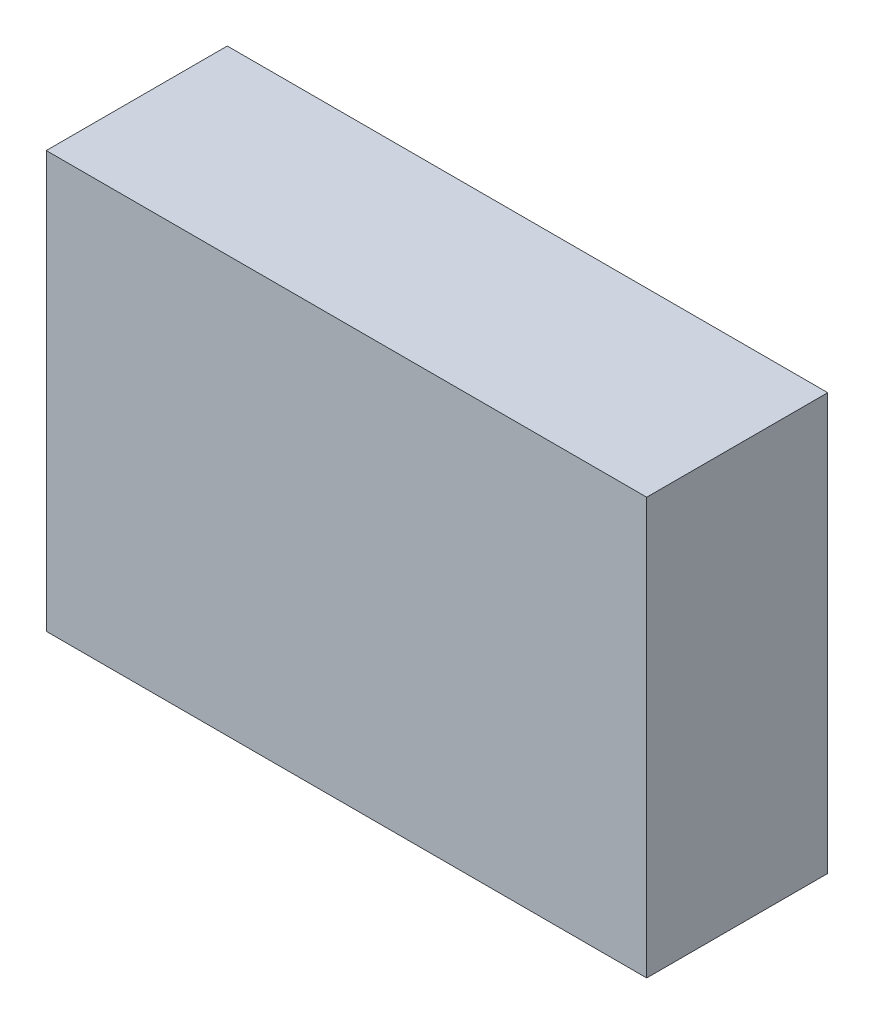
ISO-10303-21;
HEADER;
FILE_DESCRIPTION(('STEP AP214'),'2;1');
FILE_NAME('part.step','',(''),(''),'','','');
FILE_SCHEMA(('AUTOMOTIVE_DESIGN { 1 0 10303 214 1 1 1 1 }'));
ENDSEC;
DATA;
#1=APPLICATION_CONTEXT('core data for automotive mechanical design processes');
#2=APPLICATION_PROTOCOL_DEFINITION('international standard','automotive_design',2000,#1);
#3=PRODUCT_CONTEXT('',#1,'mechanical');
#4=PRODUCT('Part','Part','',(#3));
#5=PRODUCT_RELATED_PRODUCT_CATEGORY('part','',(#4));
#6=PRODUCT_DEFINITION_FORMATION('','',#4);
#7=PRODUCT_DEFINITION_CONTEXT('part definition',#1,'design');
#8=PRODUCT_DEFINITION('design','',#6,#7);
#9=PRODUCT_DEFINITION_SHAPE('','',#8);
#10=(LENGTH_UNIT() NAMED_UNIT(*) SI_UNIT(.MILLI.,.METRE.));
#11=(NAMED_UNIT(*) PLANE_ANGLE_UNIT() SI_UNIT($,.RADIAN.));
#12=(NAMED_UNIT(*) SI_UNIT($,.STERADIAN.) SOLID_ANGLE_UNIT());
#13=UNCERTAINTY_MEASURE_WITH_UNIT(LENGTH_MEASURE(1.E-05),#10,'distance_accuracy_value','');
#14=(GEOMETRIC_REPRESENTATION_CONTEXT(3) GLOBAL_UNCERTAINTY_ASSIGNED_CONTEXT((#13)) GLOBAL_UNIT_ASSIGNED_CONTEXT((#10,
#11,#12)) REPRESENTATION_CONTEXT('',''));
#15=CARTESIAN_POINT('',(0.,0.,0.));
#16=DIRECTION('',(0.,0.,1.));
#17=DIRECTION('',(1.,0.,0.));
#18=AXIS2_PLACEMENT_3D('',#15,#16,#17);
#19=CARTESIAN_POINT('',(-5.25,-3.2,3.));
#20=DIRECTION('',(1.,0.,0.));
#21=DIRECTION('',(0.,0.,-1.));
#22=AXIS2_PLACEMENT_3D('',#19,#20,#21);
#23=PLANE('',#22);
#24=DIRECTION('',(0.,-1.,0.));
#25=VECTOR('',#24,1.);
#26=CARTESIAN_POINT('',(-5.25,-3.2,0.));
#27=LINE('',#26,#25);
#28=CARTESIAN_POINT('',(-5.25,3.7,0.));
#29=VERTEX_POINT('',#28);
#30=CARTESIAN_POINT('',(-5.25,-3.2,0.));
#31=VERTEX_POINT('',#30);
#32=EDGE_CURVE('E96',#29,#31,#27,.T.);
#33=ORIENTED_EDGE('',*,*,#32,.T.);
#34=DIRECTION('',(0.,0.,-1.));
#35=VECTOR('',#34,1.);
#36=CARTESIAN_POINT('',(-5.25,-3.2,3.));
#37=LINE('',#36,#35);
#38=CARTESIAN_POINT('',(-5.25,-3.2,3.));
#39=VERTEX_POINT('',#38);
#40=EDGE_CURVE('E11',#39,#31,#37,.T.);
#41=ORIENTED_EDGE('',*,*,#40,.F.);
#42=DIRECTION('',(0.,-1.,0.));
#43=VECTOR('',#42,1.);
#44=CARTESIAN_POINT('',(-5.25,-3.2,3.));
#45=LINE('',#44,#43);
#46=CARTESIAN_POINT('',(-5.25,3.7,3.));
#47=VERTEX_POINT('',#46);
#48=EDGE_CURVE('E84',#47,#39,#45,.T.);
#49=ORIENTED_EDGE('',*,*,#48,.F.);
#50=DIRECTION('',(0.,0.,-1.));
#51=VECTOR('',#50,1.);
#52=CARTESIAN_POINT('',(-5.25,3.7,3.));
#53=LINE('',#52,#51);
#54=EDGE_CURVE('E92',#47,#29,#53,.T.);
#55=ORIENTED_EDGE('',*,*,#54,.T.);
#56=EDGE_LOOP('',(#33,#41,#49,#55));
#57=FACE_BOUND('',#56,.T.);
#58=ADVANCED_FACE('F33',(#57),#23,.F.);
#59=CARTESIAN_POINT('',(4.7,-3.2,3.));
#60=DIRECTION('',(0.,1.,0.));
#61=DIRECTION('',(0.,0.,1.));
#62=AXIS2_PLACEMENT_3D('',#59,#60,#61);
#63=PLANE('',#62);
#64=DIRECTION('',(1.,0.,0.));
#65=VECTOR('',#64,1.);
#66=CARTESIAN_POINT('',(4.7,-3.2,0.));
#67=LINE('',#66,#65);
#68=CARTESIAN_POINT('',(4.7,-3.2,0.));
#69=VERTEX_POINT('',#68);
#70=EDGE_CURVE('E88',#31,#69,#67,.T.);
#71=ORIENTED_EDGE('',*,*,#70,.T.);
#72=DIRECTION('',(0.,0.,-1.));
#73=VECTOR('',#72,1.);
#74=CARTESIAN_POINT('',(4.7,-3.2,3.));
#75=LINE('',#74,#73);
#76=CARTESIAN_POINT('',(4.7,-3.2,3.));
#77=VERTEX_POINT('',#76);
#78=EDGE_CURVE('E41',#77,#69,#75,.T.);
#79=ORIENTED_EDGE('',*,*,#78,.F.);
#80=DIRECTION('',(1.,0.,0.));
#81=VECTOR('',#80,1.);
#82=CARTESIAN_POINT('',(4.7,-3.2,3.));
#83=LINE('',#82,#81);
#84=EDGE_CURVE('E79',#39,#77,#83,.T.);
#85=ORIENTED_EDGE('',*,*,#84,.F.);
#86=ORIENTED_EDGE('',*,*,#40,.T.);
#87=EDGE_LOOP('',(#71,#79,#85,#86));
#88=FACE_BOUND('',#87,.T.);
#89=ADVANCED_FACE('F87',(#88),#63,.F.);
#90=CARTESIAN_POINT('',(4.7,3.7,3.));
#91=DIRECTION('',(-1.,0.,0.));
#92=DIRECTION('',(0.,0.,1.));
#93=AXIS2_PLACEMENT_3D('',#90,#91,#92);
#94=PLANE('',#93);
#95=DIRECTION('',(0.,1.,0.));
#96=VECTOR('',#95,1.);
#97=CARTESIAN_POINT('',(4.7,3.7,0.));
#98=LINE('',#97,#96);
#99=CARTESIAN_POINT('',(4.7,3.7,0.));
#100=VERTEX_POINT('',#99);
#101=EDGE_CURVE('E66',#69,#100,#98,.T.);
#102=ORIENTED_EDGE('',*,*,#101,.T.);
#103=DIRECTION('',(0.,0.,-1.));
#104=VECTOR('',#103,1.);
#105=CARTESIAN_POINT('',(4.7,3.7,3.));
#106=LINE('',#105,#104);
#107=CARTESIAN_POINT('',(4.7,3.7,3.));
#108=VERTEX_POINT('',#107);
#109=EDGE_CURVE('E89',#108,#100,#106,.T.);
#110=ORIENTED_EDGE('',*,*,#109,.F.);
#111=DIRECTION('',(0.,1.,0.));
#112=VECTOR('',#111,1.);
#113=CARTESIAN_POINT('',(4.7,3.7,3.));
#114=LINE('',#113,#112);
#115=EDGE_CURVE('E82',#77,#108,#114,.T.);
#116=ORIENTED_EDGE('',*,*,#115,.F.);
#117=ORIENTED_EDGE('',*,*,#78,.T.);
#118=EDGE_LOOP('',(#102,#110,#116,#117));
#119=FACE_BOUND('',#118,.T.);
#120=ADVANCED_FACE('F90',(#119),#94,.F.);
#121=CARTESIAN_POINT('',(-5.25,3.7,3.));
#122=DIRECTION('',(0.,-1.,0.));
#123=DIRECTION('',(0.,0.,-1.));
#124=AXIS2_PLACEMENT_3D('',#121,#122,#123);
#125=PLANE('',#124);
#126=DIRECTION('',(-1.,0.,0.));
#127=VECTOR('',#126,1.);
#128=CARTESIAN_POINT('',(-5.25,3.7,0.));
#129=LINE('',#128,#127);
#130=EDGE_CURVE('E72',#100,#29,#129,.T.);
#131=ORIENTED_EDGE('',*,*,#130,.T.);
#132=ORIENTED_EDGE('',*,*,#54,.F.);
#133=DIRECTION('',(-1.,0.,0.));
#134=VECTOR('',#133,1.);
#135=CARTESIAN_POINT('',(-5.25,3.7,3.));
#136=LINE('',#135,#134);
#137=EDGE_CURVE('E49',#108,#47,#136,.T.);
#138=ORIENTED_EDGE('',*,*,#137,.F.);
#139=ORIENTED_EDGE('',*,*,#109,.T.);
#140=EDGE_LOOP('',(#131,#132,#138,#139));
#141=FACE_BOUND('',#140,.T.);
#142=ADVANCED_FACE('F103',(#141),#125,.F.);
#143=CARTESIAN_POINT('',(0.,0.,3.));
#144=DIRECTION('',(0.,0.,-1.));
#145=DIRECTION('',(-1.,0.,0.));
#146=AXIS2_PLACEMENT_3D('',#143,#144,#145);
#147=PLANE('',#146);
#148=ORIENTED_EDGE('',*,*,#48,.T.);
#149=ORIENTED_EDGE('',*,*,#84,.T.);
#150=ORIENTED_EDGE('',*,*,#115,.T.);
#151=ORIENTED_EDGE('',*,*,#137,.T.);
#152=EDGE_LOOP('',(#148,#149,#150,#151));
#153=FACE_BOUND('',#152,.T.);
#154=ADVANCED_FACE('F80',(#153),#147,.F.);
#155=CARTESIAN_POINT('',(0.,0.,0.));
#156=DIRECTION('',(0.,0.,-1.));
#157=DIRECTION('',(-1.,0.,0.));
#158=AXIS2_PLACEMENT_3D('',#155,#156,#157);
#159=PLANE('',#158);
#160=ORIENTED_EDGE('',*,*,#32,.F.);
#161=ORIENTED_EDGE('',*,*,#130,.F.);
#162=ORIENTED_EDGE('',*,*,#101,.F.);
#163=ORIENTED_EDGE('',*,*,#70,.F.);
#164=EDGE_LOOP('',(#160,#161,#162,#163));
#165=FACE_BOUND('',#164,.T.);
#166=ADVANCED_FACE('F106',(#165),#159,.T.);
#167=CLOSED_SHELL('',(#58,#89,#120,#142,#154,#166));
#168=MANIFOLD_SOLID_BREP('B2',#167);
#169=ADVANCED_BREP_SHAPE_REPRESENTATION('',(#18,#168),#14);
#170=SHAPE_DEFINITION_REPRESENTATION(#9,#169);
ENDSEC;
END-ISO-10303-21;
